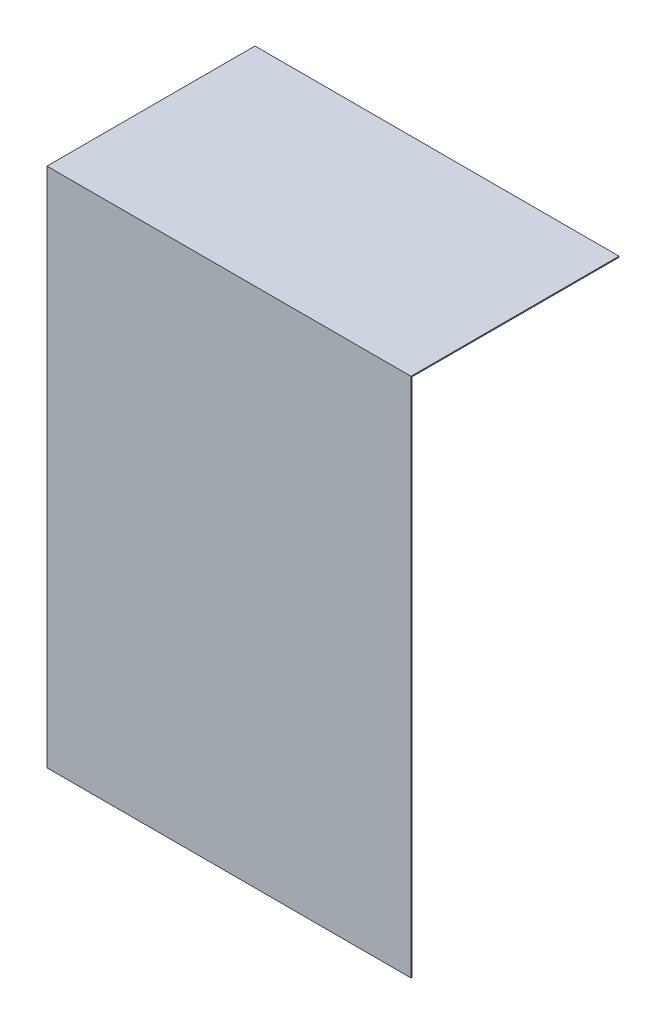
ISO-10303-21;
HEADER;
FILE_DESCRIPTION(('STEP AP214'),'2;1');
FILE_NAME('part.step','',(''),(''),'','','');
FILE_SCHEMA(('AUTOMOTIVE_DESIGN { 1 0 10303 214 1 1 1 1 }'));
ENDSEC;
DATA;
#1=APPLICATION_CONTEXT('core data for automotive mechanical design processes');
#2=APPLICATION_PROTOCOL_DEFINITION('international standard','automotive_design',2000,#1);
#3=PRODUCT_CONTEXT('',#1,'mechanical');
#4=PRODUCT('Part','Part','',(#3));
#5=PRODUCT_RELATED_PRODUCT_CATEGORY('part','',(#4));
#6=PRODUCT_DEFINITION_FORMATION('','',#4);
#7=PRODUCT_DEFINITION_CONTEXT('part definition',#1,'design');
#8=PRODUCT_DEFINITION('design','',#6,#7);
#9=PRODUCT_DEFINITION_SHAPE('','',#8);
#10=(LENGTH_UNIT() NAMED_UNIT(*) SI_UNIT(.MILLI.,.METRE.));
#11=(NAMED_UNIT(*) PLANE_ANGLE_UNIT() SI_UNIT($,.RADIAN.));
#12=(NAMED_UNIT(*) SI_UNIT($,.STERADIAN.) SOLID_ANGLE_UNIT());
#13=UNCERTAINTY_MEASURE_WITH_UNIT(LENGTH_MEASURE(1.E-05),#10,'distance_accuracy_value','');
#14=(GEOMETRIC_REPRESENTATION_CONTEXT(3) GLOBAL_UNCERTAINTY_ASSIGNED_CONTEXT((#13)) GLOBAL_UNIT_ASSIGNED_CONTEXT((#10,
#11,#12)) REPRESENTATION_CONTEXT('',''));
#15=CARTESIAN_POINT('',(0.,0.,0.));
#16=DIRECTION('',(0.,0.,1.));
#17=DIRECTION('',(1.,0.,0.));
#18=AXIS2_PLACEMENT_3D('',#15,#16,#17);
#19=CARTESIAN_POINT('',(-26.4524431837851,-0.452606159273583,-0.00109883212488396));
#20=CARTESIAN_POINT('',(-26.4524431837851,-0.452606159378491,0.000101167875116246));
#21=CARTESIAN_POINT('',(-26.0324431837852,-0.452606177632366,-0.00109883212488556));
#22=CARTESIAN_POINT('',(-26.0324431837852,-0.452606177737274,0.000101167875114641));
#23=(BOUNDED_SURFACE() B_SPLINE_SURFACE(1,1,((#19,#20),(#21,#22)),.UNSPECIFIED.,.F.,.F.,
.F.) B_SPLINE_SURFACE_WITH_KNOTS((2,2),(2,2),(-3.49999999999899E-05,0.000384999999999889),
(-1.10000000000019E-06,1.00000000000017E-07),
.UNSPECIFIED.) GEOMETRIC_REPRESENTATION_ITEM() RATIONAL_B_SPLINE_SURFACE(((1.,1.),(1.,1.))) REPRESENTATION_ITEM('') SURFACE());
#24=CARTESIAN_POINT('',(-26.0674431837852,-0.452606176198633,1.16787511475827E-06));
#25=CARTESIAN_POINT('',(-26.4174431837851,-0.452606160899647,1.16787511609575E-06));
#26=(BOUNDED_CURVE() B_SPLINE_CURVE(1,(#24,#25),.UNSPECIFIED.,.F.,
.F.) B_SPLINE_CURVE_WITH_KNOTS((2,2),(0.,0.000349999999999899),
.UNSPECIFIED.) CURVE() GEOMETRIC_REPRESENTATION_ITEM() RATIONAL_B_SPLINE_CURVE((1.,1.)) REPRESENTATION_ITEM(''));
#27=CARTESIAN_POINT('',(-26.0674431837852,-0.452606176198633,1.16787511475827E-06));
#28=VERTEX_POINT('',#27);
#29=CARTESIAN_POINT('',(-26.4174431837851,-0.452606160899649,1.16787511605931E-06));
#30=VERTEX_POINT('',#29);
#31=EDGE_CURVE('E23',#28,#30,#26,.T.);
#32=CARTESIAN_POINT('',(-26.4174431837851,-0.452606160899649,1.16787511605931E-06));
#33=CARTESIAN_POINT('',(-26.4174431837851,-0.452606160812226,-0.000998832124884073));
#34=(BOUNDED_CURVE() B_SPLINE_CURVE(1,(#32,#33),.UNSPECIFIED.,.F.,
.F.) B_SPLINE_CURVE_WITH_KNOTS((2,2),(0.,1.00000000000013E-06),
.UNSPECIFIED.) CURVE() GEOMETRIC_REPRESENTATION_ITEM() RATIONAL_B_SPLINE_CURVE((1.,1.)) REPRESENTATION_ITEM(''));
#35=CARTESIAN_POINT('',(-26.4174431837851,-0.452606160812219,-0.000998832124884073));
#36=VERTEX_POINT('',#35);
#37=EDGE_CURVE('E32',#30,#36,#34,.T.);
#38=CARTESIAN_POINT('',(-26.0674431837852,-0.452606176111203,-0.000998832124885374));
#39=CARTESIAN_POINT('',(-26.4174431837851,-0.452606160812217,-0.000998832124884037));
#40=(BOUNDED_CURVE() B_SPLINE_CURVE(1,(#38,#39),.UNSPECIFIED.,.F.,
.F.) B_SPLINE_CURVE_WITH_KNOTS((2,2),(0.,0.000349999999999899),
.UNSPECIFIED.) CURVE() GEOMETRIC_REPRESENTATION_ITEM() RATIONAL_B_SPLINE_CURVE((1.,1.)) REPRESENTATION_ITEM(''));
#41=CARTESIAN_POINT('',(-26.0674431837852,-0.452606176111203,-0.000998832124885374));
#42=VERTEX_POINT('',#41);
#43=EDGE_CURVE('E81',#42,#36,#40,.T.);
#44=CARTESIAN_POINT('',(-26.0674431837852,-0.452606176198633,1.16787511475827E-06));
#45=CARTESIAN_POINT('',(-26.0674431837852,-0.45260617611121,-0.000998832124885374));
#46=(BOUNDED_CURVE() B_SPLINE_CURVE(1,(#44,#45),.UNSPECIFIED.,.F.,
.F.) B_SPLINE_CURVE_WITH_KNOTS((2,2),(0.,1.00000000000013E-06),
.UNSPECIFIED.) CURVE() GEOMETRIC_REPRESENTATION_ITEM() RATIONAL_B_SPLINE_CURVE((1.,1.)) REPRESENTATION_ITEM(''));
#47=EDGE_CURVE('E11',#28,#42,#46,.T.);
#48=ORIENTED_EDGE('',*,*,#31,.T.);
#49=ORIENTED_EDGE('',*,*,#37,.T.);
#50=ORIENTED_EDGE('',*,*,#43,.F.);
#51=ORIENTED_EDGE('',*,*,#47,.F.);
#52=EDGE_LOOP('',(#48,#49,#50,#51));
#53=FACE_BOUND('',#52,.T.);
#54=ADVANCED_FACE('F17',(#53),#23,.T.);
#55=CARTESIAN_POINT('',(-26.0674431859751,-0.502706156965632,-0.219998836504764));
#56=CARTESIAN_POINT('',(-26.0674431859751,-0.502706177947088,0.0200011634952358));
#57=CARTESIAN_POINT('',(-26.0674431596959,0.0984938430343697,-0.219998783946216));
#58=CARTESIAN_POINT('',(-26.0674431596959,0.0984938220529135,0.0200012160537834));
#59=(BOUNDED_SURFACE() B_SPLINE_SURFACE(1,1,((#55,#56),(#57,#58)),.UNSPECIFIED.,.F.,.F.,
.F.) B_SPLINE_SURFACE_WITH_KNOTS((2,2),(2,2),(-5.01E-05,0.0005511),(-0.00022,2.E-05),
.UNSPECIFIED.) GEOMETRIC_REPRESENTATION_ITEM() RATIONAL_B_SPLINE_SURFACE(((1.,1.),(1.,1.))) REPRESENTATION_ITEM('') SURFACE());
#60=CARTESIAN_POINT('',(-26.0674431619295,0.0473938238887972,-0.000998788413518427));
#61=CARTESIAN_POINT('',(-26.0674431837852,-0.452606176111203,-0.000998832124885397));
#62=(BOUNDED_CURVE() B_SPLINE_CURVE(1,(#60,#61),.UNSPECIFIED.,.F.,
.F.) B_SPLINE_CURVE_WITH_KNOTS((2,2),(1.000000000001E-06,0.000501),
.UNSPECIFIED.) CURVE() GEOMETRIC_REPRESENTATION_ITEM() RATIONAL_B_SPLINE_CURVE((1.,1.)) REPRESENTATION_ITEM(''));
#63=CARTESIAN_POINT('',(-26.0674431619295,0.0473938238887972,-0.000998788413518383));
#64=VERTEX_POINT('',#63);
#65=EDGE_CURVE('E66',#64,#42,#62,.T.);
#66=CARTESIAN_POINT('',(-26.0674431619295,0.0473938238887898,-0.000998788413518383));
#67=CARTESIAN_POINT('',(-26.0674431619295,0.0473938412859139,-0.199998788413518));
#68=(BOUNDED_CURVE() B_SPLINE_CURVE(1,(#66,#67),.UNSPECIFIED.,.F.,
.F.) B_SPLINE_CURVE_WITH_KNOTS((2,2),(1.00000000000013E-06,0.0002),
.UNSPECIFIED.) CURVE() GEOMETRIC_REPRESENTATION_ITEM() RATIONAL_B_SPLINE_CURVE((1.,1.)) REPRESENTATION_ITEM(''));
#69=CARTESIAN_POINT('',(-26.0674431619295,0.0473938412859087,-0.199998788413518));
#70=VERTEX_POINT('',#69);
#71=EDGE_CURVE('E117',#64,#70,#68,.T.);
#72=CARTESIAN_POINT('',(-26.0674431619295,0.0473938412859087,-0.199998788413518));
#73=CARTESIAN_POINT('',(-26.0674431618858,0.0483938412859097,-0.199998788326095));
#74=(BOUNDED_CURVE() B_SPLINE_CURVE(1,(#72,#73),.UNSPECIFIED.,.F.,
.F.) B_SPLINE_CURVE_WITH_KNOTS((2,2),(-1.000000000001E-06,0.),
.UNSPECIFIED.) CURVE() GEOMETRIC_REPRESENTATION_ITEM() RATIONAL_B_SPLINE_CURVE((1.,1.)) REPRESENTATION_ITEM(''));
#75=CARTESIAN_POINT('',(-26.0674431618858,0.0483938412859097,-0.199998788326095));
#76=VERTEX_POINT('',#75);
#77=EDGE_CURVE('E151',#70,#76,#74,.T.);
#78=CARTESIAN_POINT('',(-26.0674431618858,0.0483938238013681,1.21167390444016E-06));
#79=CARTESIAN_POINT('',(-26.0674431618858,0.0483938412859149,-0.199998788326095));
#80=(BOUNDED_CURVE() B_SPLINE_CURVE(1,(#78,#79),.UNSPECIFIED.,.F.,
.F.) B_SPLINE_CURVE_WITH_KNOTS((2,2),(0.,0.0002),
.UNSPECIFIED.) CURVE() GEOMETRIC_REPRESENTATION_ITEM() RATIONAL_B_SPLINE_CURVE((1.,1.)) REPRESENTATION_ITEM(''));
#81=CARTESIAN_POINT('',(-26.0674431618858,0.0483938238013681,1.21167390444016E-06));
#82=VERTEX_POINT('',#81);
#83=EDGE_CURVE('E118',#82,#76,#80,.T.);
#84=CARTESIAN_POINT('',(-26.0674431618858,0.0483938238013681,1.21167390444016E-06));
#85=CARTESIAN_POINT('',(-26.0674431837852,-0.452606176198633,1.16787511473576E-06));
#86=(BOUNDED_CURVE() B_SPLINE_CURVE(1,(#84,#85),.UNSPECIFIED.,.F.,
.F.) B_SPLINE_CURVE_WITH_KNOTS((2,2),(0.,0.000501),
.UNSPECIFIED.) CURVE() GEOMETRIC_REPRESENTATION_ITEM() RATIONAL_B_SPLINE_CURVE((1.,1.)) REPRESENTATION_ITEM(''));
#87=EDGE_CURVE('E76',#82,#28,#86,.T.);
#88=ORIENTED_EDGE('',*,*,#47,.T.);
#89=ORIENTED_EDGE('',*,*,#65,.F.);
#90=ORIENTED_EDGE('',*,*,#71,.T.);
#91=ORIENTED_EDGE('',*,*,#77,.T.);
#92=ORIENTED_EDGE('',*,*,#83,.F.);
#93=ORIENTED_EDGE('',*,*,#87,.T.);
#94=EDGE_LOOP('',(#88,#89,#90,#91,#92,#93));
#95=FACE_BOUND('',#94,.T.);
#96=ADVANCED_FACE('F19',(#95),#59,.T.);
#97=CARTESIAN_POINT('',(-26.4174431596958,0.0984938583333541,-0.219998783946214));
#98=CARTESIAN_POINT('',(-26.4174431596958,0.098493837351898,0.0200012160537846));
#99=CARTESIAN_POINT('',(-26.417443185975,-0.502706141666648,-0.219998836504762));
#100=CARTESIAN_POINT('',(-26.417443185975,-0.502706162648104,0.020001163495237));
#101=(BOUNDED_SURFACE() B_SPLINE_SURFACE(1,1,((#97,#98),(#99,#100)),.UNSPECIFIED.,.F.,.F.,
.F.) B_SPLINE_SURFACE_WITH_KNOTS((2,2),(2,2),(-5.01E-05,0.0005511),(-0.00022,2.E-05),
.UNSPECIFIED.) GEOMETRIC_REPRESENTATION_ITEM() RATIONAL_B_SPLINE_SURFACE(((1.,1.),(1.,1.))) REPRESENTATION_ITEM('') SURFACE());
#102=CARTESIAN_POINT('',(-26.4174431837851,-0.452606160899649,1.16787511605931E-06));
#103=CARTESIAN_POINT('',(-26.4174431618857,0.0483938391003523,1.21167390576371E-06));
#104=(BOUNDED_CURVE() B_SPLINE_CURVE(1,(#102,#103),.UNSPECIFIED.,.F.,
.F.) B_SPLINE_CURVE_WITH_KNOTS((2,2),(0.,0.000501),
.UNSPECIFIED.) CURVE() GEOMETRIC_REPRESENTATION_ITEM() RATIONAL_B_SPLINE_CURVE((1.,1.)) REPRESENTATION_ITEM(''));
#105=CARTESIAN_POINT('',(-26.4174431618858,0.0483938391003524,1.2116739057412E-06));
#106=VERTEX_POINT('',#105);
#107=EDGE_CURVE('E159',#30,#106,#104,.T.);
#108=CARTESIAN_POINT('',(-26.4174431618858,0.0483938391003524,1.2116739057412E-06));
#109=CARTESIAN_POINT('',(-26.4174431618858,0.0483938565848992,-0.199998788326093));
#110=(BOUNDED_CURVE() B_SPLINE_CURVE(1,(#108,#109),.UNSPECIFIED.,.F.,
.F.) B_SPLINE_CURVE_WITH_KNOTS((2,2),(0.,0.0002),
.UNSPECIFIED.) CURVE() GEOMETRIC_REPRESENTATION_ITEM() RATIONAL_B_SPLINE_CURVE((1.,1.)) REPRESENTATION_ITEM(''));
#111=CARTESIAN_POINT('',(-26.4174431618858,0.048393856584894,-0.199998788326093));
#112=VERTEX_POINT('',#111);
#113=EDGE_CURVE('E108',#106,#112,#110,.T.);
#114=CARTESIAN_POINT('',(-26.4174431619295,0.047393856584893,-0.199998788413516));
#115=CARTESIAN_POINT('',(-26.4174431618858,0.048393856584894,-0.199998788326093));
#116=(BOUNDED_CURVE() B_SPLINE_CURVE(1,(#114,#115),.UNSPECIFIED.,.F.,
.F.) B_SPLINE_CURVE_WITH_KNOTS((2,2),(0.,1.000000000001E-06),
.UNSPECIFIED.) CURVE() GEOMETRIC_REPRESENTATION_ITEM() RATIONAL_B_SPLINE_CURVE((1.,1.)) REPRESENTATION_ITEM(''));
#117=CARTESIAN_POINT('',(-26.4174431619295,0.047393856584893,-0.199998788413516));
#118=VERTEX_POINT('',#117);
#119=EDGE_CURVE('E127',#118,#112,#116,.T.);
#120=CARTESIAN_POINT('',(-26.4174431619295,0.0473938565848982,-0.199998788413516));
#121=CARTESIAN_POINT('',(-26.4174431619295,0.0473938391877741,-0.000998788413517082));
#122=(BOUNDED_CURVE() B_SPLINE_CURVE(1,(#120,#121),.UNSPECIFIED.,.F.,
.F.) B_SPLINE_CURVE_WITH_KNOTS((2,2),(-0.0002,-1.00000000000011E-06),
.UNSPECIFIED.) CURVE() GEOMETRIC_REPRESENTATION_ITEM() RATIONAL_B_SPLINE_CURVE((1.,1.)) REPRESENTATION_ITEM(''));
#123=CARTESIAN_POINT('',(-26.4174431619295,0.0473938391877815,-0.000998788413517082));
#124=VERTEX_POINT('',#123);
#125=EDGE_CURVE('E88',#118,#124,#122,.T.);
#126=CARTESIAN_POINT('',(-26.4174431837851,-0.452606160812219,-0.000998832124884073));
#127=CARTESIAN_POINT('',(-26.4174431619294,0.0473938391877814,-0.000998788413517103));
#128=(BOUNDED_CURVE() B_SPLINE_CURVE(1,(#126,#127),.UNSPECIFIED.,.F.,
.F.) B_SPLINE_CURVE_WITH_KNOTS((2,2),(0.,0.0005),
.UNSPECIFIED.) CURVE() GEOMETRIC_REPRESENTATION_ITEM() RATIONAL_B_SPLINE_CURVE((1.,1.)) REPRESENTATION_ITEM(''));
#129=EDGE_CURVE('E72',#36,#124,#128,.T.);
#130=ORIENTED_EDGE('',*,*,#107,.T.);
#131=ORIENTED_EDGE('',*,*,#113,.T.);
#132=ORIENTED_EDGE('',*,*,#119,.F.);
#133=ORIENTED_EDGE('',*,*,#125,.T.);
#134=ORIENTED_EDGE('',*,*,#129,.F.);
#135=ORIENTED_EDGE('',*,*,#37,.F.);
#136=EDGE_LOOP('',(#130,#131,#132,#133,#134,#135));
#137=FACE_BOUND('',#136,.T.);
#138=ADVANCED_FACE('F374',(#137),#101,.T.);
#139=CARTESIAN_POINT('',(-26.0324431859751,-0.502706177728534,1.16349523563158E-06));
#140=CARTESIAN_POINT('',(-26.4524431859751,-0.502706159369751,1.16349523723655E-06));
#141=CARTESIAN_POINT('',(-26.0324431596959,0.0984938222714698,1.21605378327685E-06));
#142=CARTESIAN_POINT('',(-26.4524431596959,0.0984938406302529,1.21605378488183E-06));
#143=(BOUNDED_SURFACE() B_SPLINE_SURFACE(1,1,((#139,#140),(#141,#142)),.UNSPECIFIED.,.F.,.F.,
.F.) B_SPLINE_SURFACE_WITH_KNOTS((2,2),(2,2),(-0.0005511,5.01E-05),(-3.5000000000004E-05,
0.000385),.UNSPECIFIED.) GEOMETRIC_REPRESENTATION_ITEM() RATIONAL_B_SPLINE_SURFACE(((1.,1.),(1.,1.))) REPRESENTATION_ITEM('') SURFACE());
#144=CARTESIAN_POINT('',(-26.4174431618858,0.0483938391003524,1.2116739057412E-06));
#145=CARTESIAN_POINT('',(-26.0674431618858,0.0483938238013665,1.21167390440372E-06));
#146=(BOUNDED_CURVE() B_SPLINE_CURVE(1,(#144,#145),.UNSPECIFIED.,.F.,
.F.) B_SPLINE_CURVE_WITH_KNOTS((2,2),(0.,0.00035),
.UNSPECIFIED.) CURVE() GEOMETRIC_REPRESENTATION_ITEM() RATIONAL_B_SPLINE_CURVE((1.,1.)) REPRESENTATION_ITEM(''));
#147=EDGE_CURVE('E247',#106,#82,#146,.T.);
#148=ORIENTED_EDGE('',*,*,#87,.F.);
#149=ORIENTED_EDGE('',*,*,#147,.F.);
#150=ORIENTED_EDGE('',*,*,#107,.F.);
#151=ORIENTED_EDGE('',*,*,#31,.F.);
#152=EDGE_LOOP('',(#148,#149,#150,#151));
#153=FACE_BOUND('',#152,.T.);
#154=ADVANCED_FACE('F355',(#153),#143,.T.);
#155=CARTESIAN_POINT('',(-26.0324431597439,0.0973938223588988,-0.000998784042381864));
#156=CARTESIAN_POINT('',(-26.4524431597439,0.0973938407176819,-0.000998784042380259));
#157=CARTESIAN_POINT('',(-26.0324431859708,-0.502606177641104,-0.000998836496022228));
#158=CARTESIAN_POINT('',(-26.4524431859708,-0.502606159282321,-0.000998836496020623));
#159=(BOUNDED_SURFACE() B_SPLINE_SURFACE(1,1,((#155,#156),(#157,#158)),.UNSPECIFIED.,.F.,.F.,
.F.) B_SPLINE_SURFACE_WITH_KNOTS((2,2),(2,2),(-0.000551,4.9E-05),(-3.50000000000108E-05,
0.000384999999999994),
.UNSPECIFIED.) GEOMETRIC_REPRESENTATION_ITEM() RATIONAL_B_SPLINE_SURFACE(((1.,1.),(1.,1.))) REPRESENTATION_ITEM('') SURFACE());
#160=CARTESIAN_POINT('',(-26.4174431619295,0.0473938391877831,-0.000998788413517045));
#161=CARTESIAN_POINT('',(-26.0674431619295,0.0473938238887972,-0.000998788413518383));
#162=(BOUNDED_CURVE() B_SPLINE_CURVE(1,(#160,#161),.UNSPECIFIED.,.F.,
.F.) B_SPLINE_CURVE_WITH_KNOTS((2,2),(-0.00035,0.),
.UNSPECIFIED.) CURVE() GEOMETRIC_REPRESENTATION_ITEM() RATIONAL_B_SPLINE_CURVE((1.,1.)) REPRESENTATION_ITEM(''));
#163=EDGE_CURVE('E83',#124,#64,#162,.T.);
#164=ORIENTED_EDGE('',*,*,#43,.T.);
#165=ORIENTED_EDGE('',*,*,#129,.T.);
#166=ORIENTED_EDGE('',*,*,#163,.T.);
#167=ORIENTED_EDGE('',*,*,#65,.T.);
#168=EDGE_LOOP('',(#164,#165,#166,#167));
#169=FACE_BOUND('',#168,.T.);
#170=ADVANCED_FACE('F80',(#169),#159,.T.);
#171=CARTESIAN_POINT('',(-26.0324431619295,0.0473938414957278,-0.219898788413518));
#172=CARTESIAN_POINT('',(-26.4524431619295,0.0473938598545108,-0.219898788413516));
#173=CARTESIAN_POINT('',(-26.0324431619295,0.0473938206191788,0.0189012115864814));
#174=CARTESIAN_POINT('',(-26.4524431619295,0.0473938389779619,0.018901211586483));
#175=(BOUNDED_SURFACE() B_SPLINE_SURFACE(1,1,((#171,#172),(#173,#174)),.UNSPECIFIED.,.F.,.F.,
.F.) B_SPLINE_SURFACE_WITH_KNOTS((2,2),(2,2),(-0.0002199,1.89E-05),(-3.5E-05,0.000385),
.UNSPECIFIED.) GEOMETRIC_REPRESENTATION_ITEM() RATIONAL_B_SPLINE_SURFACE(((1.,1.),(1.,1.))) REPRESENTATION_ITEM('') SURFACE());
#176=CARTESIAN_POINT('',(-26.0674431619295,0.0473938412859087,-0.199998788413518));
#177=CARTESIAN_POINT('',(-26.4174431619295,0.0473938565848946,-0.199998788413517));
#178=(BOUNDED_CURVE() B_SPLINE_CURVE(1,(#176,#177),.UNSPECIFIED.,.F.,
.F.) B_SPLINE_CURVE_WITH_KNOTS((2,2),(0.,0.00035),
.UNSPECIFIED.) CURVE() GEOMETRIC_REPRESENTATION_ITEM() RATIONAL_B_SPLINE_CURVE((1.,1.)) REPRESENTATION_ITEM(''));
#179=EDGE_CURVE('E119',#70,#118,#178,.T.);
#180=ORIENTED_EDGE('',*,*,#71,.F.);
#181=ORIENTED_EDGE('',*,*,#163,.F.);
#182=ORIENTED_EDGE('',*,*,#125,.F.);
#183=ORIENTED_EDGE('',*,*,#179,.F.);
#184=EDGE_LOOP('',(#180,#181,#182,#183));
#185=FACE_BOUND('',#184,.T.);
#186=ADVANCED_FACE('F354',(#185),#175,.T.);
#187=CARTESIAN_POINT('',(-26.0324431618858,0.0483938415044694,-0.219998788326095));
#188=CARTESIAN_POINT('',(-26.0324431618858,0.0483938205230132,0.0200012116739042));
#189=CARTESIAN_POINT('',(-26.4524431618858,0.0483938598632525,-0.219998788326093));
#190=CARTESIAN_POINT('',(-26.4524431618858,0.0483938388817963,0.0200012116739059));
#191=(BOUNDED_SURFACE() B_SPLINE_SURFACE(1,1,((#187,#188),(#189,#190)),.UNSPECIFIED.,.F.,.F.,
.F.) B_SPLINE_SURFACE_WITH_KNOTS((2,2),(2,2),(-3.5E-05,0.000385),(-0.00022,2.E-05),
.UNSPECIFIED.) GEOMETRIC_REPRESENTATION_ITEM() RATIONAL_B_SPLINE_SURFACE(((1.,1.),(1.,1.))) REPRESENTATION_ITEM('') SURFACE());
#192=CARTESIAN_POINT('',(-26.0674431618858,0.0483938412859097,-0.199998788326095));
#193=CARTESIAN_POINT('',(-26.4174431618858,0.0483938565848956,-0.199998788326094));
#194=(BOUNDED_CURVE() B_SPLINE_CURVE(1,(#192,#193),.UNSPECIFIED.,.F.,
.F.) B_SPLINE_CURVE_WITH_KNOTS((2,2),(0.,0.00035),
.UNSPECIFIED.) CURVE() GEOMETRIC_REPRESENTATION_ITEM() RATIONAL_B_SPLINE_CURVE((1.,1.)) REPRESENTATION_ITEM(''));
#195=EDGE_CURVE('E143',#76,#112,#194,.T.);
#196=ORIENTED_EDGE('',*,*,#147,.T.);
#197=ORIENTED_EDGE('',*,*,#83,.T.);
#198=ORIENTED_EDGE('',*,*,#195,.T.);
#199=ORIENTED_EDGE('',*,*,#113,.F.);
#200=EDGE_LOOP('',(#196,#197,#198,#199));
#201=FACE_BOUND('',#200,.T.);
#202=ADVANCED_FACE('F344',(#201),#191,.T.);
#203=CARTESIAN_POINT('',(-26.4524431618814,0.0484938581147944,-0.199998788317352));
#204=CARTESIAN_POINT('',(-26.4524431619339,0.0472938581147913,-0.199998788422259));
#205=CARTESIAN_POINT('',(-26.0324431618814,0.0484938397560114,-0.199998788317353));
#206=CARTESIAN_POINT('',(-26.0324431619339,0.0472938397560083,-0.19999878842226));
#207=(BOUNDED_SURFACE() B_SPLINE_SURFACE(1,1,((#203,#204),(#205,#206)),.UNSPECIFIED.,.F.,.F.,
.F.) B_SPLINE_SURFACE_WITH_KNOTS((2,2),(2,2),(-3.5000000000001E-05,0.000385000000000011),
(-1.10000000000126E-06,1.0000000000186E-07),
.UNSPECIFIED.) GEOMETRIC_REPRESENTATION_ITEM() RATIONAL_B_SPLINE_SURFACE(((1.,1.),(1.,1.))) REPRESENTATION_ITEM('') SURFACE());
#208=ORIENTED_EDGE('',*,*,#179,.T.);
#209=ORIENTED_EDGE('',*,*,#119,.T.);
#210=ORIENTED_EDGE('',*,*,#195,.F.);
#211=ORIENTED_EDGE('',*,*,#77,.F.);
#212=EDGE_LOOP('',(#208,#209,#210,#211));
#213=FACE_BOUND('',#212,.T.);
#214=ADVANCED_FACE('F339',(#213),#207,.T.);
#215=CLOSED_SHELL('',(#54,#96,#138,#154,#170,#186,#202,#214));
#216=MANIFOLD_SOLID_BREP('B1',#215);
#217=ADVANCED_BREP_SHAPE_REPRESENTATION('',(#18,#216),#14);
#218=SHAPE_DEFINITION_REPRESENTATION(#9,#217);
ENDSEC;
END-ISO-10303-21;
